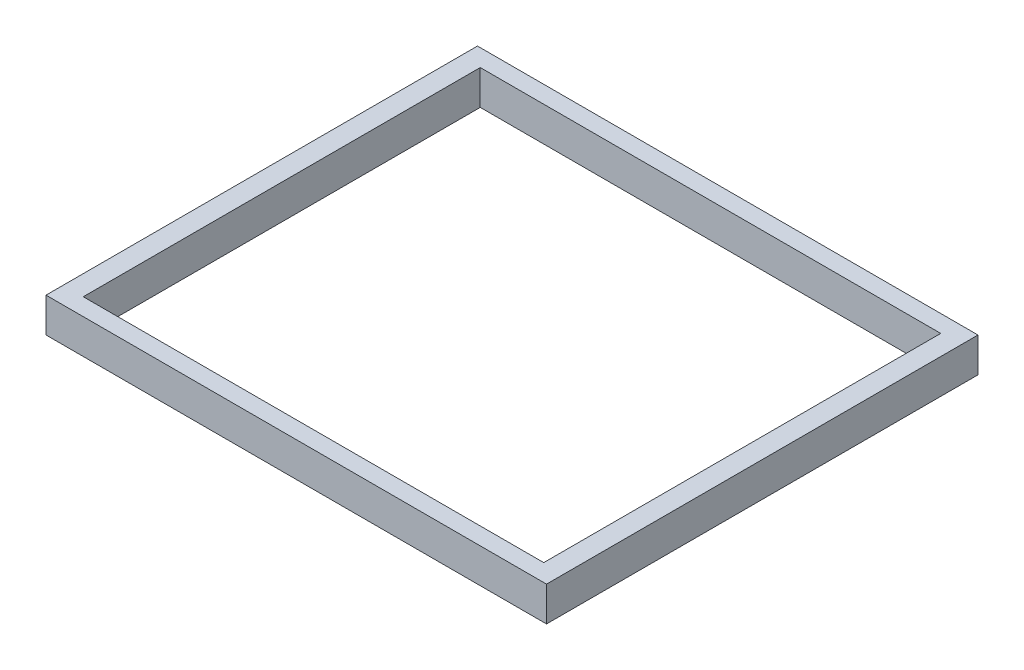
ISO-10303-21;
HEADER;
FILE_DESCRIPTION(('STEP AP214'),'2;1');
FILE_NAME('part.step','',(''),(''),'','','');
FILE_SCHEMA(('AUTOMOTIVE_DESIGN { 1 0 10303 214 1 1 1 1 }'));
ENDSEC;
DATA;
#1=APPLICATION_CONTEXT('core data for automotive mechanical design processes');
#2=APPLICATION_PROTOCOL_DEFINITION('international standard','automotive_design',2000,#1);
#3=PRODUCT_CONTEXT('',#1,'mechanical');
#4=PRODUCT('Part','Part','',(#3));
#5=PRODUCT_RELATED_PRODUCT_CATEGORY('part','',(#4));
#6=PRODUCT_DEFINITION_FORMATION('','',#4);
#7=PRODUCT_DEFINITION_CONTEXT('part definition',#1,'design');
#8=PRODUCT_DEFINITION('design','',#6,#7);
#9=PRODUCT_DEFINITION_SHAPE('','',#8);
#10=(LENGTH_UNIT() NAMED_UNIT(*) SI_UNIT(.MILLI.,.METRE.));
#11=(NAMED_UNIT(*) PLANE_ANGLE_UNIT() SI_UNIT($,.RADIAN.));
#12=(NAMED_UNIT(*) SI_UNIT($,.STERADIAN.) SOLID_ANGLE_UNIT());
#13=UNCERTAINTY_MEASURE_WITH_UNIT(LENGTH_MEASURE(1.E-05),#10,'distance_accuracy_value','');
#14=(GEOMETRIC_REPRESENTATION_CONTEXT(3) GLOBAL_UNCERTAINTY_ASSIGNED_CONTEXT((#13)) GLOBAL_UNIT_ASSIGNED_CONTEXT((#10,
#11,#12)) REPRESENTATION_CONTEXT('',''));
#15=CARTESIAN_POINT('',(0.,0.,0.));
#16=DIRECTION('',(0.,0.,1.));
#17=DIRECTION('',(1.,0.,0.));
#18=AXIS2_PLACEMENT_3D('',#15,#16,#17);
#19=CARTESIAN_POINT('',(0.,50.8,0.));
#20=DIRECTION('',(0.,-1.,0.));
#21=DIRECTION('',(0.,0.,-1.));
#22=AXIS2_PLACEMENT_3D('',#19,#20,#21);
#23=PLANE('',#22);
#24=DIRECTION('',(0.,0.,-1.));
#25=VECTOR('',#24,1.);
#26=CARTESIAN_POINT('',(368.3,50.8,317.5));
#27=LINE('',#26,#25);
#28=CARTESIAN_POINT('',(368.3,50.8,317.5));
#29=VERTEX_POINT('',#28);
#30=CARTESIAN_POINT('',(368.3,50.8,-317.5));
#31=VERTEX_POINT('',#30);
#32=EDGE_CURVE('E142',#29,#31,#27,.T.);
#33=ORIENTED_EDGE('',*,*,#32,.T.);
#34=DIRECTION('',(-1.,0.,0.));
#35=VECTOR('',#34,1.);
#36=CARTESIAN_POINT('',(-368.3,50.8,-317.5));
#37=LINE('',#36,#35);
#38=CARTESIAN_POINT('',(-368.3,50.8,-317.5));
#39=VERTEX_POINT('',#38);
#40=EDGE_CURVE('E145',#31,#39,#37,.T.);
#41=ORIENTED_EDGE('',*,*,#40,.T.);
#42=DIRECTION('',(0.,0.,1.));
#43=VECTOR('',#42,1.);
#44=CARTESIAN_POINT('',(-368.3,50.8,317.5));
#45=LINE('',#44,#43);
#46=CARTESIAN_POINT('',(-368.3,50.8,317.5));
#47=VERTEX_POINT('',#46);
#48=EDGE_CURVE('E148',#39,#47,#45,.T.);
#49=ORIENTED_EDGE('',*,*,#48,.T.);
#50=DIRECTION('',(1.,0.,0.));
#51=VECTOR('',#50,1.);
#52=CARTESIAN_POINT('',(-368.3,50.8,317.5));
#53=LINE('',#52,#51);
#54=EDGE_CURVE('E150',#47,#29,#53,.T.);
#55=ORIENTED_EDGE('',*,*,#54,.T.);
#56=EDGE_LOOP('',(#33,#41,#49,#55));
#57=FACE_BOUND('',#56,.T.);
#58=DIRECTION('',(0.,0.,-1.));
#59=VECTOR('',#58,1.);
#60=CARTESIAN_POINT('',(338.836,50.8,292.1));
#61=LINE('',#60,#59);
#62=CARTESIAN_POINT('',(338.836,50.8,292.1));
#63=VERTEX_POINT('',#62);
#64=CARTESIAN_POINT('',(338.836,50.8,-292.1));
#65=VERTEX_POINT('',#64);
#66=EDGE_CURVE('E106',#63,#65,#61,.T.);
#67=ORIENTED_EDGE('',*,*,#66,.F.);
#68=DIRECTION('',(1.,0.,0.));
#69=VECTOR('',#68,1.);
#70=CARTESIAN_POINT('',(-338.836,50.8,292.1));
#71=LINE('',#70,#69);
#72=CARTESIAN_POINT('',(-338.836,50.8,292.1));
#73=VERTEX_POINT('',#72);
#74=EDGE_CURVE('E128',#73,#63,#71,.T.);
#75=ORIENTED_EDGE('',*,*,#74,.F.);
#76=DIRECTION('',(0.,0.,1.));
#77=VECTOR('',#76,1.);
#78=CARTESIAN_POINT('',(-338.836,50.8,292.1));
#79=LINE('',#78,#77);
#80=CARTESIAN_POINT('',(-338.836,50.8,-292.1));
#81=VERTEX_POINT('',#80);
#82=EDGE_CURVE('E126',#81,#73,#79,.T.);
#83=ORIENTED_EDGE('',*,*,#82,.F.);
#84=DIRECTION('',(-1.,0.,0.));
#85=VECTOR('',#84,1.);
#86=CARTESIAN_POINT('',(-338.836,50.8,-292.1));
#87=LINE('',#86,#85);
#88=EDGE_CURVE('E114',#65,#81,#87,.T.);
#89=ORIENTED_EDGE('',*,*,#88,.F.);
#90=EDGE_LOOP('',(#67,#75,#83,#89));
#91=FACE_BOUND('',#90,.T.);
#92=ADVANCED_FACE('F41',(#57,#91),#23,.F.);
#93=CARTESIAN_POINT('',(0.,0.,0.));
#94=DIRECTION('',(0.,-1.,0.));
#95=DIRECTION('',(0.,0.,-1.));
#96=AXIS2_PLACEMENT_3D('',#93,#94,#95);
#97=PLANE('',#96);
#98=DIRECTION('',(0.,0.,-1.));
#99=VECTOR('',#98,1.);
#100=CARTESIAN_POINT('',(368.3,0.,317.5));
#101=LINE('',#100,#99);
#102=CARTESIAN_POINT('',(368.3,0.,317.5));
#103=VERTEX_POINT('',#102);
#104=CARTESIAN_POINT('',(368.3,0.,-317.5));
#105=VERTEX_POINT('',#104);
#106=EDGE_CURVE('E122',#103,#105,#101,.T.);
#107=ORIENTED_EDGE('',*,*,#106,.F.);
#108=DIRECTION('',(1.,0.,0.));
#109=VECTOR('',#108,1.);
#110=CARTESIAN_POINT('',(-368.3,0.,317.5));
#111=LINE('',#110,#109);
#112=CARTESIAN_POINT('',(-368.3,0.,317.5));
#113=VERTEX_POINT('',#112);
#114=EDGE_CURVE('E146',#113,#103,#111,.T.);
#115=ORIENTED_EDGE('',*,*,#114,.F.);
#116=DIRECTION('',(0.,0.,1.));
#117=VECTOR('',#116,1.);
#118=CARTESIAN_POINT('',(-368.3,0.,317.5));
#119=LINE('',#118,#117);
#120=CARTESIAN_POINT('',(-368.3,0.,-317.5));
#121=VERTEX_POINT('',#120);
#122=EDGE_CURVE('E157',#121,#113,#119,.T.);
#123=ORIENTED_EDGE('',*,*,#122,.F.);
#124=DIRECTION('',(-1.,0.,0.));
#125=VECTOR('',#124,1.);
#126=CARTESIAN_POINT('',(-368.3,0.,-317.5));
#127=LINE('',#126,#125);
#128=EDGE_CURVE('E155',#105,#121,#127,.T.);
#129=ORIENTED_EDGE('',*,*,#128,.F.);
#130=EDGE_LOOP('',(#107,#115,#123,#129));
#131=FACE_BOUND('',#130,.T.);
#132=DIRECTION('',(1.,0.,0.));
#133=VECTOR('',#132,1.);
#134=CARTESIAN_POINT('',(-338.836,0.,292.1));
#135=LINE('',#134,#133);
#136=CARTESIAN_POINT('',(-338.836,0.,292.1));
#137=VERTEX_POINT('',#136);
#138=CARTESIAN_POINT('',(338.836,0.,292.1));
#139=VERTEX_POINT('',#138);
#140=EDGE_CURVE('E115',#137,#139,#135,.T.);
#141=ORIENTED_EDGE('',*,*,#140,.T.);
#142=DIRECTION('',(0.,0.,-1.));
#143=VECTOR('',#142,1.);
#144=CARTESIAN_POINT('',(338.836,0.,292.1));
#145=LINE('',#144,#143);
#146=CARTESIAN_POINT('',(338.836,0.,-292.1));
#147=VERTEX_POINT('',#146);
#148=EDGE_CURVE('E64',#139,#147,#145,.T.);
#149=ORIENTED_EDGE('',*,*,#148,.T.);
#150=DIRECTION('',(-1.,0.,0.));
#151=VECTOR('',#150,1.);
#152=CARTESIAN_POINT('',(-338.836,0.,-292.1));
#153=LINE('',#152,#151);
#154=CARTESIAN_POINT('',(-338.836,0.,-292.1));
#155=VERTEX_POINT('',#154);
#156=EDGE_CURVE('E121',#147,#155,#153,.T.);
#157=ORIENTED_EDGE('',*,*,#156,.T.);
#158=DIRECTION('',(0.,0.,1.));
#159=VECTOR('',#158,1.);
#160=CARTESIAN_POINT('',(-338.836,0.,292.1));
#161=LINE('',#160,#159);
#162=EDGE_CURVE('E134',#155,#137,#161,.T.);
#163=ORIENTED_EDGE('',*,*,#162,.T.);
#164=EDGE_LOOP('',(#141,#149,#157,#163));
#165=FACE_BOUND('',#164,.T.);
#166=ADVANCED_FACE('F175',(#131,#165),#97,.T.);
#167=CARTESIAN_POINT('',(368.3,50.8,317.5));
#168=DIRECTION('',(-1.,0.,0.));
#169=DIRECTION('',(0.,0.,1.));
#170=AXIS2_PLACEMENT_3D('',#167,#168,#169);
#171=PLANE('',#170);
#172=ORIENTED_EDGE('',*,*,#106,.T.);
#173=DIRECTION('',(0.,-1.,0.));
#174=VECTOR('',#173,1.);
#175=CARTESIAN_POINT('',(368.3,50.8,-317.5));
#176=LINE('',#175,#174);
#177=EDGE_CURVE('E11',#31,#105,#176,.T.);
#178=ORIENTED_EDGE('',*,*,#177,.F.);
#179=ORIENTED_EDGE('',*,*,#32,.F.);
#180=DIRECTION('',(0.,-1.,0.));
#181=VECTOR('',#180,1.);
#182=CARTESIAN_POINT('',(368.3,50.8,317.5));
#183=LINE('',#182,#181);
#184=EDGE_CURVE('E152',#29,#103,#183,.T.);
#185=ORIENTED_EDGE('',*,*,#184,.T.);
#186=EDGE_LOOP('',(#172,#178,#179,#185));
#187=FACE_BOUND('',#186,.T.);
#188=ADVANCED_FACE('F43',(#187),#171,.F.);
#189=CARTESIAN_POINT('',(-368.3,50.8,-317.5));
#190=DIRECTION('',(0.,0.,1.));
#191=DIRECTION('',(1.,0.,0.));
#192=AXIS2_PLACEMENT_3D('',#189,#190,#191);
#193=PLANE('',#192);
#194=ORIENTED_EDGE('',*,*,#128,.T.);
#195=DIRECTION('',(0.,-1.,0.));
#196=VECTOR('',#195,1.);
#197=CARTESIAN_POINT('',(-368.3,50.8,-317.5));
#198=LINE('',#197,#196);
#199=EDGE_CURVE('E49',#39,#121,#198,.T.);
#200=ORIENTED_EDGE('',*,*,#199,.F.);
#201=ORIENTED_EDGE('',*,*,#40,.F.);
#202=ORIENTED_EDGE('',*,*,#177,.T.);
#203=EDGE_LOOP('',(#194,#200,#201,#202));
#204=FACE_BOUND('',#203,.T.);
#205=ADVANCED_FACE('F185',(#204),#193,.F.);
#206=CARTESIAN_POINT('',(-368.3,50.8,317.5));
#207=DIRECTION('',(1.,0.,0.));
#208=DIRECTION('',(0.,0.,-1.));
#209=AXIS2_PLACEMENT_3D('',#206,#207,#208);
#210=PLANE('',#209);
#211=ORIENTED_EDGE('',*,*,#122,.T.);
#212=DIRECTION('',(0.,-1.,0.));
#213=VECTOR('',#212,1.);
#214=CARTESIAN_POINT('',(-368.3,50.8,317.5));
#215=LINE('',#214,#213);
#216=EDGE_CURVE('E162',#47,#113,#215,.T.);
#217=ORIENTED_EDGE('',*,*,#216,.F.);
#218=ORIENTED_EDGE('',*,*,#48,.F.);
#219=ORIENTED_EDGE('',*,*,#199,.T.);
#220=EDGE_LOOP('',(#211,#217,#218,#219));
#221=FACE_BOUND('',#220,.T.);
#222=ADVANCED_FACE('F169',(#221),#210,.F.);
#223=CARTESIAN_POINT('',(-368.3,50.8,317.5));
#224=DIRECTION('',(0.,0.,-1.));
#225=DIRECTION('',(-1.,0.,0.));
#226=AXIS2_PLACEMENT_3D('',#223,#224,#225);
#227=PLANE('',#226);
#228=ORIENTED_EDGE('',*,*,#114,.T.);
#229=ORIENTED_EDGE('',*,*,#184,.F.);
#230=ORIENTED_EDGE('',*,*,#54,.F.);
#231=ORIENTED_EDGE('',*,*,#216,.T.);
#232=EDGE_LOOP('',(#228,#229,#230,#231));
#233=FACE_BOUND('',#232,.T.);
#234=ADVANCED_FACE('F179',(#233),#227,.F.);
#235=CARTESIAN_POINT('',(338.836,50.8,292.1));
#236=DIRECTION('',(-1.,0.,0.));
#237=DIRECTION('',(0.,0.,1.));
#238=AXIS2_PLACEMENT_3D('',#235,#236,#237);
#239=PLANE('',#238);
#240=ORIENTED_EDGE('',*,*,#148,.F.);
#241=DIRECTION('',(0.,-1.,0.));
#242=VECTOR('',#241,1.);
#243=CARTESIAN_POINT('',(338.836,50.8,292.1));
#244=LINE('',#243,#242);
#245=EDGE_CURVE('E110',#63,#139,#244,.T.);
#246=ORIENTED_EDGE('',*,*,#245,.F.);
#247=ORIENTED_EDGE('',*,*,#66,.T.);
#248=DIRECTION('',(0.,-1.,0.));
#249=VECTOR('',#248,1.);
#250=CARTESIAN_POINT('',(338.836,50.8,-292.1));
#251=LINE('',#250,#249);
#252=EDGE_CURVE('E109',#65,#147,#251,.T.);
#253=ORIENTED_EDGE('',*,*,#252,.T.);
#254=EDGE_LOOP('',(#240,#246,#247,#253));
#255=FACE_BOUND('',#254,.T.);
#256=ADVANCED_FACE('F108',(#255),#239,.T.);
#257=CARTESIAN_POINT('',(-338.836,50.8,-292.1));
#258=DIRECTION('',(0.,0.,1.));
#259=DIRECTION('',(1.,0.,0.));
#260=AXIS2_PLACEMENT_3D('',#257,#258,#259);
#261=PLANE('',#260);
#262=ORIENTED_EDGE('',*,*,#156,.F.);
#263=ORIENTED_EDGE('',*,*,#252,.F.);
#264=ORIENTED_EDGE('',*,*,#88,.T.);
#265=DIRECTION('',(0.,-1.,0.));
#266=VECTOR('',#265,1.);
#267=CARTESIAN_POINT('',(-338.836,50.8,-292.1));
#268=LINE('',#267,#266);
#269=EDGE_CURVE('E123',#81,#155,#268,.T.);
#270=ORIENTED_EDGE('',*,*,#269,.T.);
#271=EDGE_LOOP('',(#262,#263,#264,#270));
#272=FACE_BOUND('',#271,.T.);
#273=ADVANCED_FACE('F118',(#272),#261,.T.);
#274=CARTESIAN_POINT('',(-338.836,50.8,292.1));
#275=DIRECTION('',(1.,0.,0.));
#276=DIRECTION('',(0.,0.,-1.));
#277=AXIS2_PLACEMENT_3D('',#274,#275,#276);
#278=PLANE('',#277);
#279=ORIENTED_EDGE('',*,*,#162,.F.);
#280=ORIENTED_EDGE('',*,*,#269,.F.);
#281=ORIENTED_EDGE('',*,*,#82,.T.);
#282=DIRECTION('',(0.,-1.,0.));
#283=VECTOR('',#282,1.);
#284=CARTESIAN_POINT('',(-338.836,50.8,292.1));
#285=LINE('',#284,#283);
#286=EDGE_CURVE('E56',#73,#137,#285,.T.);
#287=ORIENTED_EDGE('',*,*,#286,.T.);
#288=EDGE_LOOP('',(#279,#280,#281,#287));
#289=FACE_BOUND('',#288,.T.);
#290=ADVANCED_FACE('F208',(#289),#278,.T.);
#291=CARTESIAN_POINT('',(-338.836,50.8,292.1));
#292=DIRECTION('',(0.,0.,-1.));
#293=DIRECTION('',(-1.,0.,0.));
#294=AXIS2_PLACEMENT_3D('',#291,#292,#293);
#295=PLANE('',#294);
#296=ORIENTED_EDGE('',*,*,#140,.F.);
#297=ORIENTED_EDGE('',*,*,#286,.F.);
#298=ORIENTED_EDGE('',*,*,#74,.T.);
#299=ORIENTED_EDGE('',*,*,#245,.T.);
#300=EDGE_LOOP('',(#296,#297,#298,#299));
#301=FACE_BOUND('',#300,.T.);
#302=ADVANCED_FACE('F212',(#301),#295,.T.);
#303=CLOSED_SHELL('',(#92,#166,#188,#205,#222,#234,#256,#273,#290,#302));
#304=MANIFOLD_SOLID_BREP('B2',#303);
#305=ADVANCED_BREP_SHAPE_REPRESENTATION('',(#18,#304),#14);
#306=SHAPE_DEFINITION_REPRESENTATION(#9,#305);
ENDSEC;
END-ISO-10303-21;
